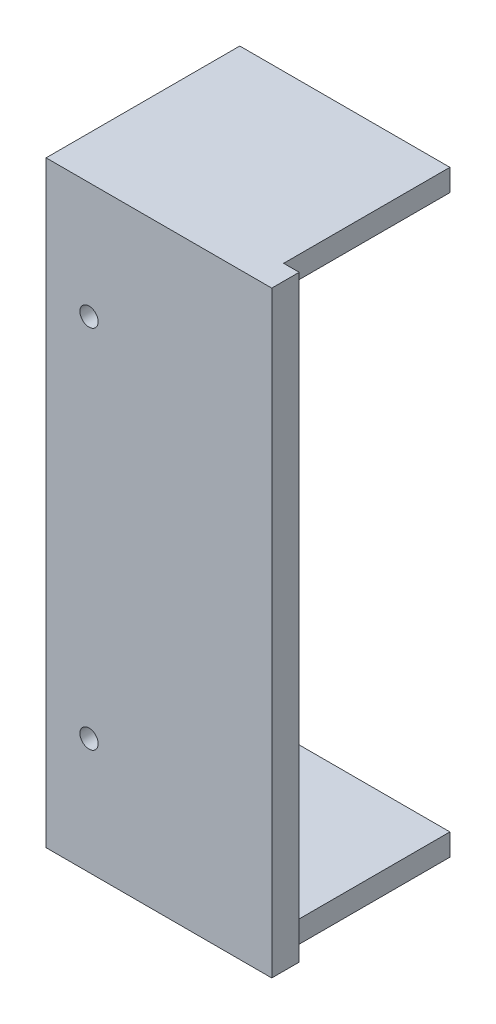
ISO-10303-21;
HEADER;
FILE_DESCRIPTION(('STEP AP214'),'2;1');
FILE_NAME('part.step','',(''),(''),'','','');
FILE_SCHEMA(('AUTOMOTIVE_DESIGN { 1 0 10303 214 1 1 1 1 }'));
ENDSEC;
DATA;
#1=APPLICATION_CONTEXT('core data for automotive mechanical design processes');
#2=APPLICATION_PROTOCOL_DEFINITION('international standard','automotive_design',2000,#1);
#3=PRODUCT_CONTEXT('',#1,'mechanical');
#4=PRODUCT('Part','Part','',(#3));
#5=PRODUCT_RELATED_PRODUCT_CATEGORY('part','',(#4));
#6=PRODUCT_DEFINITION_FORMATION('','',#4);
#7=PRODUCT_DEFINITION_CONTEXT('part definition',#1,'design');
#8=PRODUCT_DEFINITION('design','',#6,#7);
#9=PRODUCT_DEFINITION_SHAPE('','',#8);
#10=(LENGTH_UNIT() NAMED_UNIT(*) SI_UNIT(.MILLI.,.METRE.));
#11=(NAMED_UNIT(*) PLANE_ANGLE_UNIT() SI_UNIT($,.RADIAN.));
#12=(NAMED_UNIT(*) SI_UNIT($,.STERADIAN.) SOLID_ANGLE_UNIT());
#13=UNCERTAINTY_MEASURE_WITH_UNIT(LENGTH_MEASURE(1.E-05),#10,'distance_accuracy_value','');
#14=(GEOMETRIC_REPRESENTATION_CONTEXT(3) GLOBAL_UNCERTAINTY_ASSIGNED_CONTEXT((#13)) GLOBAL_UNIT_ASSIGNED_CONTEXT((#10,
#11,#12)) REPRESENTATION_CONTEXT('',''));
#15=CARTESIAN_POINT('',(0.,0.,0.));
#16=DIRECTION('',(0.,0.,1.));
#17=DIRECTION('',(1.,0.,0.));
#18=AXIS2_PLACEMENT_3D('',#15,#16,#17);
#19=CARTESIAN_POINT('',(-94.7,32.7,370.2));
#20=DIRECTION('',(1.,0.,0.));
#21=DIRECTION('',(0.,0.,-1.));
#22=AXIS2_PLACEMENT_3D('',#19,#20,#21);
#23=PLANE('',#22);
#24=DIRECTION('',(0.,-1.,0.));
#25=VECTOR('',#24,1.);
#26=CARTESIAN_POINT('',(-94.7,32.7,352.));
#27=LINE('',#26,#25);
#28=CARTESIAN_POINT('',(-94.7,32.7,352.));
#29=VERTEX_POINT('',#28);
#30=CARTESIAN_POINT('',(-94.7,-32.7,352.));
#31=VERTEX_POINT('',#30);
#32=EDGE_CURVE('E148',#29,#31,#27,.T.);
#33=ORIENTED_EDGE('',*,*,#32,.T.);
#34=DIRECTION('',(0.,0.,-1.));
#35=VECTOR('',#34,1.);
#36=CARTESIAN_POINT('',(-94.7,-32.7,370.2));
#37=LINE('',#36,#35);
#38=CARTESIAN_POINT('',(-94.7,-32.7,373.2));
#39=VERTEX_POINT('',#38);
#40=EDGE_CURVE('E11',#39,#31,#37,.T.);
#41=ORIENTED_EDGE('',*,*,#40,.F.);
#42=DIRECTION('',(0.,-1.,0.));
#43=VECTOR('',#42,1.);
#44=CARTESIAN_POINT('',(-94.7,32.7,373.2));
#45=LINE('',#44,#43);
#46=CARTESIAN_POINT('',(-94.7,32.7,373.2));
#47=VERTEX_POINT('',#46);
#48=EDGE_CURVE('E183',#47,#39,#45,.T.);
#49=ORIENTED_EDGE('',*,*,#48,.F.);
#50=DIRECTION('',(0.,0.,-1.));
#51=VECTOR('',#50,1.);
#52=CARTESIAN_POINT('',(-94.7,32.7,370.2));
#53=LINE('',#52,#51);
#54=EDGE_CURVE('E144',#47,#29,#53,.T.);
#55=ORIENTED_EDGE('',*,*,#54,.T.);
#56=EDGE_LOOP('',(#33,#41,#49,#55));
#57=FACE_BOUND('',#56,.T.);
#58=ADVANCED_FACE('F43',(#57),#23,.F.);
#59=CARTESIAN_POINT('',(-94.7,-32.7,370.2));
#60=DIRECTION('',(0.,1.,0.));
#61=DIRECTION('',(0.,0.,1.));
#62=AXIS2_PLACEMENT_3D('',#59,#60,#61);
#63=PLANE('',#62);
#64=DIRECTION('',(1.,0.,0.));
#65=VECTOR('',#64,1.);
#66=CARTESIAN_POINT('',(-94.7,-32.7,352.));
#67=LINE('',#66,#65);
#68=CARTESIAN_POINT('',(-71.7,-32.7,352.));
#69=VERTEX_POINT('',#68);
#70=EDGE_CURVE('E149',#31,#69,#67,.T.);
#71=ORIENTED_EDGE('',*,*,#70,.T.);
#72=DIRECTION('',(0.,0.,-1.));
#73=VECTOR('',#72,1.);
#74=CARTESIAN_POINT('',(-71.7,-32.7,370.2));
#75=LINE('',#74,#73);
#76=CARTESIAN_POINT('',(-71.7,-32.7,370.2));
#77=VERTEX_POINT('',#76);
#78=EDGE_CURVE('E51',#77,#69,#75,.T.);
#79=ORIENTED_EDGE('',*,*,#78,.F.);
#80=DIRECTION('',(1.,0.,0.));
#81=VECTOR('',#80,1.);
#82=CARTESIAN_POINT('',(-94.7,-32.7,370.2));
#83=LINE('',#82,#81);
#84=CARTESIAN_POINT('',(-70.,-32.7,370.2));
#85=VERTEX_POINT('',#84);
#86=EDGE_CURVE('E191',#77,#85,#83,.T.);
#87=ORIENTED_EDGE('',*,*,#86,.T.);
#88=DIRECTION('',(0.,0.,-1.));
#89=VECTOR('',#88,1.);
#90=CARTESIAN_POINT('',(-70.,-32.7,373.2));
#91=LINE('',#90,#89);
#92=CARTESIAN_POINT('',(-70.,-32.7,373.2));
#93=VERTEX_POINT('',#92);
#94=EDGE_CURVE('E147',#93,#85,#91,.T.);
#95=ORIENTED_EDGE('',*,*,#94,.F.);
#96=DIRECTION('',(1.,0.,0.));
#97=VECTOR('',#96,1.);
#98=CARTESIAN_POINT('',(-94.7,-32.7,373.2));
#99=LINE('',#98,#97);
#100=EDGE_CURVE('E186',#39,#93,#99,.T.);
#101=ORIENTED_EDGE('',*,*,#100,.F.);
#102=ORIENTED_EDGE('',*,*,#40,.T.);
#103=EDGE_LOOP('',(#71,#79,#87,#95,#101,#102));
#104=FACE_BOUND('',#103,.T.);
#105=ADVANCED_FACE('F249',(#104),#63,.F.);
#106=CARTESIAN_POINT('',(-71.7,-32.7,370.2));
#107=DIRECTION('',(-1.,0.,0.));
#108=DIRECTION('',(0.,0.,1.));
#109=AXIS2_PLACEMENT_3D('',#106,#107,#108);
#110=PLANE('',#109);
#111=DIRECTION('',(0.,1.,0.));
#112=VECTOR('',#111,1.);
#113=CARTESIAN_POINT('',(-71.7,-32.7,352.));
#114=LINE('',#113,#112);
#115=CARTESIAN_POINT('',(-71.7,-30.3,352.));
#116=VERTEX_POINT('',#115);
#117=EDGE_CURVE('E155',#69,#116,#114,.T.);
#118=ORIENTED_EDGE('',*,*,#117,.T.);
#119=DIRECTION('',(0.,0.,-1.));
#120=VECTOR('',#119,1.);
#121=CARTESIAN_POINT('',(-71.7,-30.3,370.2));
#122=LINE('',#121,#120);
#123=CARTESIAN_POINT('',(-71.7,-30.3,370.2));
#124=VERTEX_POINT('',#123);
#125=EDGE_CURVE('E125',#124,#116,#122,.T.);
#126=ORIENTED_EDGE('',*,*,#125,.F.);
#127=DIRECTION('',(0.,1.,0.));
#128=VECTOR('',#127,1.);
#129=CARTESIAN_POINT('',(-71.7,-32.7,370.2));
#130=LINE('',#129,#128);
#131=EDGE_CURVE('E139',#77,#124,#130,.T.);
#132=ORIENTED_EDGE('',*,*,#131,.F.);
#133=ORIENTED_EDGE('',*,*,#78,.T.);
#134=EDGE_LOOP('',(#118,#126,#132,#133));
#135=FACE_BOUND('',#134,.T.);
#136=ADVANCED_FACE('F169',(#135),#110,.F.);
#137=CARTESIAN_POINT('',(-71.7,-30.3,370.2));
#138=DIRECTION('',(0.,-1.,0.));
#139=DIRECTION('',(0.,0.,-1.));
#140=AXIS2_PLACEMENT_3D('',#137,#138,#139);
#141=PLANE('',#140);
#142=DIRECTION('',(-1.,0.,0.));
#143=VECTOR('',#142,1.);
#144=CARTESIAN_POINT('',(-71.7,-30.3,352.));
#145=LINE('',#144,#143);
#146=CARTESIAN_POINT('',(-92.3,-30.3,352.));
#147=VERTEX_POINT('',#146);
#148=EDGE_CURVE('E118',#116,#147,#145,.T.);
#149=ORIENTED_EDGE('',*,*,#148,.T.);
#150=DIRECTION('',(0.,0.,-1.));
#151=VECTOR('',#150,1.);
#152=CARTESIAN_POINT('',(-92.3,-30.3,370.2));
#153=LINE('',#152,#151);
#154=CARTESIAN_POINT('',(-92.3,-30.3,370.2));
#155=VERTEX_POINT('',#154);
#156=EDGE_CURVE('E115',#155,#147,#153,.T.);
#157=ORIENTED_EDGE('',*,*,#156,.F.);
#158=DIRECTION('',(-1.,0.,0.));
#159=VECTOR('',#158,1.);
#160=CARTESIAN_POINT('',(-71.7,-30.3,370.2));
#161=LINE('',#160,#159);
#162=EDGE_CURVE('E120',#124,#155,#161,.T.);
#163=ORIENTED_EDGE('',*,*,#162,.F.);
#164=ORIENTED_EDGE('',*,*,#125,.T.);
#165=EDGE_LOOP('',(#149,#157,#163,#164));
#166=FACE_BOUND('',#165,.T.);
#167=ADVANCED_FACE('F111',(#166),#141,.F.);
#168=CARTESIAN_POINT('',(-92.3,-30.3,370.2));
#169=DIRECTION('',(-1.,0.,0.));
#170=DIRECTION('',(0.,0.,1.));
#171=AXIS2_PLACEMENT_3D('',#168,#169,#170);
#172=PLANE('',#171);
#173=DIRECTION('',(0.,1.,0.));
#174=VECTOR('',#173,1.);
#175=CARTESIAN_POINT('',(-92.3,-30.3,352.));
#176=LINE('',#175,#174);
#177=CARTESIAN_POINT('',(-92.3,30.3,352.));
#178=VERTEX_POINT('',#177);
#179=EDGE_CURVE('E154',#147,#178,#176,.T.);
#180=ORIENTED_EDGE('',*,*,#179,.T.);
#181=DIRECTION('',(0.,0.,-1.));
#182=VECTOR('',#181,1.);
#183=CARTESIAN_POINT('',(-92.3,30.3,370.2));
#184=LINE('',#183,#182);
#185=CARTESIAN_POINT('',(-92.3,30.3,370.2));
#186=VERTEX_POINT('',#185);
#187=EDGE_CURVE('E123',#186,#178,#184,.T.);
#188=ORIENTED_EDGE('',*,*,#187,.F.);
#189=DIRECTION('',(0.,1.,0.));
#190=VECTOR('',#189,1.);
#191=CARTESIAN_POINT('',(-92.3,-30.3,370.2));
#192=LINE('',#191,#190);
#193=EDGE_CURVE('E130',#155,#186,#192,.T.);
#194=ORIENTED_EDGE('',*,*,#193,.F.);
#195=ORIENTED_EDGE('',*,*,#156,.T.);
#196=EDGE_LOOP('',(#180,#188,#194,#195));
#197=FACE_BOUND('',#196,.T.);
#198=ADVANCED_FACE('F126',(#197),#172,.F.);
#199=CARTESIAN_POINT('',(-92.3,30.3,370.2));
#200=DIRECTION('',(0.,1.,0.));
#201=DIRECTION('',(0.,0.,1.));
#202=AXIS2_PLACEMENT_3D('',#199,#200,#201);
#203=PLANE('',#202);
#204=DIRECTION('',(1.,0.,0.));
#205=VECTOR('',#204,1.);
#206=CARTESIAN_POINT('',(-92.3,30.3,352.));
#207=LINE('',#206,#205);
#208=CARTESIAN_POINT('',(-71.7,30.3,352.));
#209=VERTEX_POINT('',#208);
#210=EDGE_CURVE('E160',#178,#209,#207,.T.);
#211=ORIENTED_EDGE('',*,*,#210,.T.);
#212=DIRECTION('',(0.,0.,-1.));
#213=VECTOR('',#212,1.);
#214=CARTESIAN_POINT('',(-71.7,30.3,370.2));
#215=LINE('',#214,#213);
#216=CARTESIAN_POINT('',(-71.7,30.3,370.2));
#217=VERTEX_POINT('',#216);
#218=EDGE_CURVE('E56',#217,#209,#215,.T.);
#219=ORIENTED_EDGE('',*,*,#218,.F.);
#220=DIRECTION('',(1.,0.,0.));
#221=VECTOR('',#220,1.);
#222=CARTESIAN_POINT('',(-92.3,30.3,370.2));
#223=LINE('',#222,#221);
#224=EDGE_CURVE('E135',#186,#217,#223,.T.);
#225=ORIENTED_EDGE('',*,*,#224,.F.);
#226=ORIENTED_EDGE('',*,*,#187,.T.);
#227=EDGE_LOOP('',(#211,#219,#225,#226));
#228=FACE_BOUND('',#227,.T.);
#229=ADVANCED_FACE('F174',(#228),#203,.F.);
#230=CARTESIAN_POINT('',(-71.7,30.3,370.2));
#231=DIRECTION('',(-1.,0.,0.));
#232=DIRECTION('',(0.,0.,1.));
#233=AXIS2_PLACEMENT_3D('',#230,#231,#232);
#234=PLANE('',#233);
#235=DIRECTION('',(0.,1.,0.));
#236=VECTOR('',#235,1.);
#237=CARTESIAN_POINT('',(-71.7,30.3,352.));
#238=LINE('',#237,#236);
#239=CARTESIAN_POINT('',(-71.7,32.7,352.));
#240=VERTEX_POINT('',#239);
#241=EDGE_CURVE('E86',#209,#240,#238,.T.);
#242=ORIENTED_EDGE('',*,*,#241,.T.);
#243=DIRECTION('',(0.,0.,-1.));
#244=VECTOR('',#243,1.);
#245=CARTESIAN_POINT('',(-71.7,32.7,370.2));
#246=LINE('',#245,#244);
#247=CARTESIAN_POINT('',(-71.7,32.7,370.2));
#248=VERTEX_POINT('',#247);
#249=EDGE_CURVE('E165',#248,#240,#246,.T.);
#250=ORIENTED_EDGE('',*,*,#249,.F.);
#251=DIRECTION('',(0.,1.,0.));
#252=VECTOR('',#251,1.);
#253=CARTESIAN_POINT('',(-71.7,30.3,370.2));
#254=LINE('',#253,#252);
#255=EDGE_CURVE('E142',#217,#248,#254,.T.);
#256=ORIENTED_EDGE('',*,*,#255,.F.);
#257=ORIENTED_EDGE('',*,*,#218,.T.);
#258=EDGE_LOOP('',(#242,#250,#256,#257));
#259=FACE_BOUND('',#258,.T.);
#260=ADVANCED_FACE('F257',(#259),#234,.F.);
#261=CARTESIAN_POINT('',(-71.7,32.7,370.2));
#262=DIRECTION('',(0.,-1.,0.));
#263=DIRECTION('',(0.,0.,-1.));
#264=AXIS2_PLACEMENT_3D('',#261,#262,#263);
#265=PLANE('',#264);
#266=DIRECTION('',(-1.,0.,0.));
#267=VECTOR('',#266,1.);
#268=CARTESIAN_POINT('',(-71.7,32.7,352.));
#269=LINE('',#268,#267);
#270=EDGE_CURVE('E92',#240,#29,#269,.T.);
#271=ORIENTED_EDGE('',*,*,#270,.T.);
#272=ORIENTED_EDGE('',*,*,#54,.F.);
#273=DIRECTION('',(-1.,0.,0.));
#274=VECTOR('',#273,1.);
#275=CARTESIAN_POINT('',(-70.,32.7,373.2));
#276=LINE('',#275,#274);
#277=CARTESIAN_POINT('',(-70.,32.7,373.2));
#278=VERTEX_POINT('',#277);
#279=EDGE_CURVE('E198',#278,#47,#276,.T.);
#280=ORIENTED_EDGE('',*,*,#279,.F.);
#281=DIRECTION('',(0.,0.,-1.));
#282=VECTOR('',#281,1.);
#283=CARTESIAN_POINT('',(-70.,32.7,373.2));
#284=LINE('',#283,#282);
#285=CARTESIAN_POINT('',(-70.,32.7,370.2));
#286=VERTEX_POINT('',#285);
#287=EDGE_CURVE('E184',#278,#286,#284,.T.);
#288=ORIENTED_EDGE('',*,*,#287,.T.);
#289=DIRECTION('',(-1.,0.,0.));
#290=VECTOR('',#289,1.);
#291=CARTESIAN_POINT('',(-70.,32.7,370.2));
#292=LINE('',#291,#290);
#293=EDGE_CURVE('E180',#286,#248,#292,.T.);
#294=ORIENTED_EDGE('',*,*,#293,.T.);
#295=ORIENTED_EDGE('',*,*,#249,.T.);
#296=EDGE_LOOP('',(#271,#272,#280,#288,#294,#295));
#297=FACE_BOUND('',#296,.T.);
#298=ADVANCED_FACE('F182',(#297),#265,.F.);
#299=CARTESIAN_POINT('',(0.,0.,352.));
#300=DIRECTION('',(0.,0.,1.));
#301=DIRECTION('',(1.,0.,0.));
#302=AXIS2_PLACEMENT_3D('',#299,#300,#301);
#303=PLANE('',#302);
#304=ORIENTED_EDGE('',*,*,#32,.F.);
#305=ORIENTED_EDGE('',*,*,#270,.F.);
#306=ORIENTED_EDGE('',*,*,#241,.F.);
#307=ORIENTED_EDGE('',*,*,#210,.F.);
#308=ORIENTED_EDGE('',*,*,#179,.F.);
#309=ORIENTED_EDGE('',*,*,#148,.F.);
#310=ORIENTED_EDGE('',*,*,#117,.F.);
#311=ORIENTED_EDGE('',*,*,#70,.F.);
#312=EDGE_LOOP('',(#304,#305,#306,#307,#308,#309,#310,#311));
#313=FACE_BOUND('',#312,.T.);
#314=ADVANCED_FACE('F172',(#313),#303,.F.);
#315=CARTESIAN_POINT('',(0.,0.,370.2));
#316=DIRECTION('',(0.,0.,1.));
#317=DIRECTION('',(1.,0.,0.));
#318=AXIS2_PLACEMENT_3D('',#315,#316,#317);
#319=PLANE('',#318);
#320=CARTESIAN_POINT('',(-90.,20.,370.2));
#321=DIRECTION('',(0.,0.,1.));
#322=DIRECTION('',(1.,0.,0.));
#323=AXIS2_PLACEMENT_3D('',#320,#321,#322);
#324=CIRCLE('',#323,1.);
#325=CARTESIAN_POINT('',(-89.,20.,370.2));
#326=VERTEX_POINT('',#325);
#327=EDGE_CURVE('E208',#326,#326,#324,.T.);
#328=ORIENTED_EDGE('',*,*,#327,.T.);
#329=EDGE_LOOP('',(#328));
#330=FACE_BOUND('',#329,.T.);
#331=CARTESIAN_POINT('',(-90.,-20.,370.2));
#332=DIRECTION('',(0.,0.,1.));
#333=DIRECTION('',(1.,0.,0.));
#334=AXIS2_PLACEMENT_3D('',#331,#332,#333);
#335=CIRCLE('',#334,1.);
#336=CARTESIAN_POINT('',(-89.,-20.,370.2));
#337=VERTEX_POINT('',#336);
#338=EDGE_CURVE('E209',#337,#337,#335,.T.);
#339=ORIENTED_EDGE('',*,*,#338,.T.);
#340=EDGE_LOOP('',(#339));
#341=FACE_BOUND('',#340,.T.);
#342=ORIENTED_EDGE('',*,*,#86,.F.);
#343=ORIENTED_EDGE('',*,*,#131,.T.);
#344=ORIENTED_EDGE('',*,*,#162,.T.);
#345=ORIENTED_EDGE('',*,*,#193,.T.);
#346=ORIENTED_EDGE('',*,*,#224,.T.);
#347=ORIENTED_EDGE('',*,*,#255,.T.);
#348=ORIENTED_EDGE('',*,*,#293,.F.);
#349=DIRECTION('',(0.,1.,0.));
#350=VECTOR('',#349,1.);
#351=CARTESIAN_POINT('',(-70.,-32.7,370.2));
#352=LINE('',#351,#350);
#353=EDGE_CURVE('E187',#85,#286,#352,.T.);
#354=ORIENTED_EDGE('',*,*,#353,.F.);
#355=EDGE_LOOP('',(#342,#343,#344,#345,#346,#347,#348,#354));
#356=FACE_BOUND('',#355,.T.);
#357=ADVANCED_FACE('F133',(#330,#341,#356),#319,.F.);
#358=CARTESIAN_POINT('',(-70.,-32.7,373.2));
#359=DIRECTION('',(-1.,0.,0.));
#360=DIRECTION('',(0.,0.,1.));
#361=AXIS2_PLACEMENT_3D('',#358,#359,#360);
#362=PLANE('',#361);
#363=ORIENTED_EDGE('',*,*,#353,.T.);
#364=ORIENTED_EDGE('',*,*,#287,.F.);
#365=DIRECTION('',(0.,1.,0.));
#366=VECTOR('',#365,1.);
#367=CARTESIAN_POINT('',(-70.,-32.7,373.2));
#368=LINE('',#367,#366);
#369=EDGE_CURVE('E202',#93,#278,#368,.T.);
#370=ORIENTED_EDGE('',*,*,#369,.F.);
#371=ORIENTED_EDGE('',*,*,#94,.T.);
#372=EDGE_LOOP('',(#363,#364,#370,#371));
#373=FACE_BOUND('',#372,.T.);
#374=ADVANCED_FACE('F205',(#373),#362,.F.);
#375=CARTESIAN_POINT('',(0.,0.,373.2));
#376=DIRECTION('',(0.,0.,1.));
#377=DIRECTION('',(1.,0.,0.));
#378=AXIS2_PLACEMENT_3D('',#375,#376,#377);
#379=PLANE('',#378);
#380=CARTESIAN_POINT('',(-90.,20.,373.2));
#381=DIRECTION('',(0.,0.,1.));
#382=DIRECTION('',(1.,0.,0.));
#383=AXIS2_PLACEMENT_3D('',#380,#381,#382);
#384=CIRCLE('',#383,1.);
#385=CARTESIAN_POINT('',(-89.,20.,373.2));
#386=VERTEX_POINT('',#385);
#387=EDGE_CURVE('E219',#386,#386,#384,.T.);
#388=ORIENTED_EDGE('',*,*,#387,.F.);
#389=EDGE_LOOP('',(#388));
#390=FACE_BOUND('',#389,.T.);
#391=CARTESIAN_POINT('',(-90.,-20.,373.2));
#392=DIRECTION('',(0.,0.,1.));
#393=DIRECTION('',(1.,0.,0.));
#394=AXIS2_PLACEMENT_3D('',#391,#392,#393);
#395=CIRCLE('',#394,1.);
#396=CARTESIAN_POINT('',(-89.,-20.,373.2));
#397=VERTEX_POINT('',#396);
#398=EDGE_CURVE('E222',#397,#397,#395,.T.);
#399=ORIENTED_EDGE('',*,*,#398,.F.);
#400=EDGE_LOOP('',(#399));
#401=FACE_BOUND('',#400,.T.);
#402=ORIENTED_EDGE('',*,*,#48,.T.);
#403=ORIENTED_EDGE('',*,*,#100,.T.);
#404=ORIENTED_EDGE('',*,*,#369,.T.);
#405=ORIENTED_EDGE('',*,*,#279,.T.);
#406=EDGE_LOOP('',(#402,#403,#404,#405));
#407=FACE_BOUND('',#406,.T.);
#408=ADVANCED_FACE('F228',(#390,#401,#407),#379,.T.);
#409=CARTESIAN_POINT('',(-90.,-20.,352.));
#410=DIRECTION('',(0.,0.,1.));
#411=DIRECTION('',(1.,0.,0.));
#412=AXIS2_PLACEMENT_3D('',#409,#410,#411);
#413=CYLINDRICAL_SURFACE('',#412,1.);
#414=ORIENTED_EDGE('',*,*,#398,.T.);
#415=EDGE_LOOP('',(#414));
#416=FACE_BOUND('',#415,.T.);
#417=ORIENTED_EDGE('',*,*,#338,.F.);
#418=EDGE_LOOP('',(#417));
#419=FACE_BOUND('',#418,.T.);
#420=ADVANCED_FACE('F235',(#416,#419),#413,.F.);
#421=CARTESIAN_POINT('',(-90.,20.,352.));
#422=DIRECTION('',(0.,0.,1.));
#423=DIRECTION('',(1.,0.,0.));
#424=AXIS2_PLACEMENT_3D('',#421,#422,#423);
#425=CYLINDRICAL_SURFACE('',#424,1.);
#426=ORIENTED_EDGE('',*,*,#387,.T.);
#427=EDGE_LOOP('',(#426));
#428=FACE_BOUND('',#427,.T.);
#429=ORIENTED_EDGE('',*,*,#327,.F.);
#430=EDGE_LOOP('',(#429));
#431=FACE_BOUND('',#430,.T.);
#432=ADVANCED_FACE('F230',(#428,#431),#425,.F.);
#433=CLOSED_SHELL('',(#58,#105,#136,#167,#198,#229,#260,#298,#314,#357,#374,#408,#420,#432));
#434=MANIFOLD_SOLID_BREP('B2',#433);
#435=ADVANCED_BREP_SHAPE_REPRESENTATION('',(#18,#434),#14);
#436=SHAPE_DEFINITION_REPRESENTATION(#9,#435);
ENDSEC;
END-ISO-10303-21;
